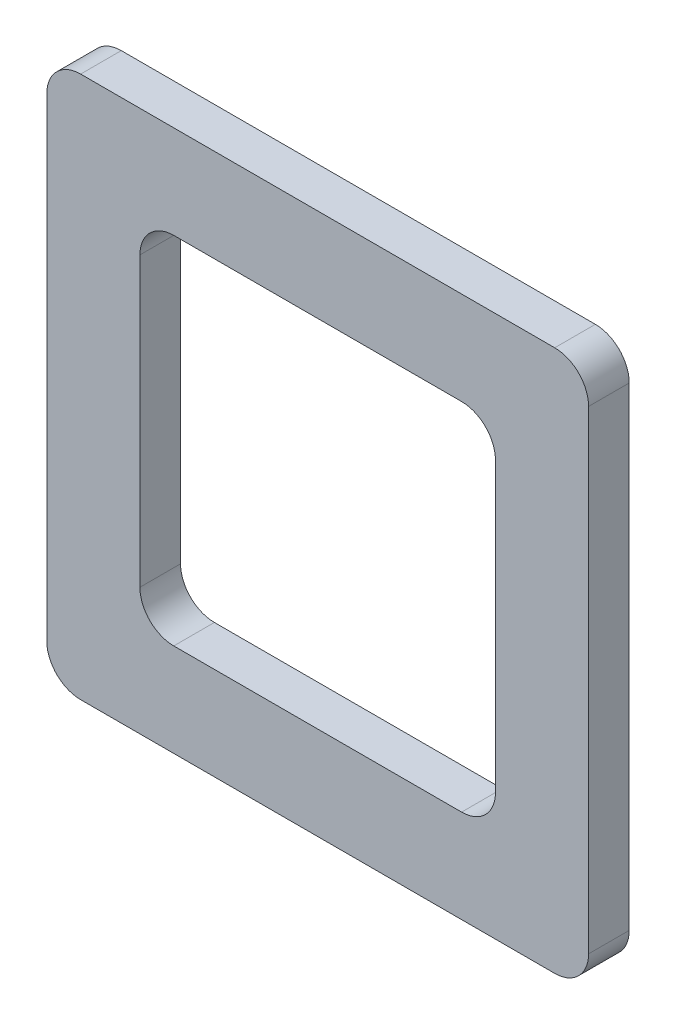
ISO-10303-21;
HEADER;
FILE_DESCRIPTION(('STEP AP214'),'2;1');
FILE_NAME('part.step','',(''),(''),'','','');
FILE_SCHEMA(('AUTOMOTIVE_DESIGN { 1 0 10303 214 1 1 1 1 }'));
ENDSEC;
DATA;
#1=APPLICATION_CONTEXT('core data for automotive mechanical design processes');
#2=APPLICATION_PROTOCOL_DEFINITION('international standard','automotive_design',2000,#1);
#3=PRODUCT_CONTEXT('',#1,'mechanical');
#4=PRODUCT('Part','Part','',(#3));
#5=PRODUCT_RELATED_PRODUCT_CATEGORY('part','',(#4));
#6=PRODUCT_DEFINITION_FORMATION('','',#4);
#7=PRODUCT_DEFINITION_CONTEXT('part definition',#1,'design');
#8=PRODUCT_DEFINITION('design','',#6,#7);
#9=PRODUCT_DEFINITION_SHAPE('','',#8);
#10=(LENGTH_UNIT() NAMED_UNIT(*) SI_UNIT(.MILLI.,.METRE.));
#11=(NAMED_UNIT(*) PLANE_ANGLE_UNIT() SI_UNIT($,.RADIAN.));
#12=(NAMED_UNIT(*) SI_UNIT($,.STERADIAN.) SOLID_ANGLE_UNIT());
#13=UNCERTAINTY_MEASURE_WITH_UNIT(LENGTH_MEASURE(1.E-05),#10,'distance_accuracy_value','');
#14=(GEOMETRIC_REPRESENTATION_CONTEXT(3) GLOBAL_UNCERTAINTY_ASSIGNED_CONTEXT((#13)) GLOBAL_UNIT_ASSIGNED_CONTEXT((#10,
#11,#12)) REPRESENTATION_CONTEXT('',''));
#15=CARTESIAN_POINT('',(0.,0.,0.));
#16=DIRECTION('',(0.,0.,1.));
#17=DIRECTION('',(1.,0.,0.));
#18=AXIS2_PLACEMENT_3D('',#15,#16,#17);
#19=CARTESIAN_POINT('',(9.99999999999979,150.,11.9999999999998));
#20=DIRECTION('',(0.,0.,-0.999999999999992));
#21=DIRECTION('',(-1.,0.,0.));
#22=AXIS2_PLACEMENT_3D('',#19,#20,#21);
#23=CYLINDRICAL_SURFACE('',#22,10.);
#24=CARTESIAN_POINT('',(9.9999999999999,150.,4.44089209850063E-13));
#25=DIRECTION('',(0.,0.,0.999999999999992));
#26=DIRECTION('',(-1.,0.,0.));
#27=AXIS2_PLACEMENT_3D('',#24,#25,#26);
#28=CIRCLE('',#27,10.);
#29=CARTESIAN_POINT('',(10.,160.,2.22044604925031E-13));
#30=VERTEX_POINT('',#29);
#31=CARTESIAN_POINT('',(-2.22044604925031E-13,150.,0.));
#32=VERTEX_POINT('',#31);
#33=EDGE_CURVE('E205',#30,#32,#28,.T.);
#34=ORIENTED_EDGE('',*,*,#33,.T.);
#35=DIRECTION('',(0.,0.,-0.999999999999992));
#36=VECTOR('',#35,1.);
#37=CARTESIAN_POINT('',(-3.33066907387547E-13,150.,12.));
#38=LINE('',#37,#36);
#39=CARTESIAN_POINT('',(-3.33066907387547E-13,150.,12.));
#40=VERTEX_POINT('',#39);
#41=EDGE_CURVE('E11',#40,#32,#38,.T.);
#42=ORIENTED_EDGE('',*,*,#41,.F.);
#43=CARTESIAN_POINT('',(9.99999999999979,150.,11.9999999999998));
#44=DIRECTION('',(0.,0.,0.999999999999992));
#45=DIRECTION('',(-1.,0.,0.));
#46=AXIS2_PLACEMENT_3D('',#43,#44,#45);
#47=CIRCLE('',#46,10.);
#48=CARTESIAN_POINT('',(9.9999999999999,160.,12.));
#49=VERTEX_POINT('',#48);
#50=EDGE_CURVE('E232',#49,#40,#47,.T.);
#51=ORIENTED_EDGE('',*,*,#50,.F.);
#52=DIRECTION('',(0.,0.,-0.999999999999992));
#53=VECTOR('',#52,1.);
#54=CARTESIAN_POINT('',(9.9999999999999,160.,12.));
#55=LINE('',#54,#53);
#56=EDGE_CURVE('E249',#49,#30,#55,.T.);
#57=ORIENTED_EDGE('',*,*,#56,.T.);
#58=EDGE_LOOP('',(#34,#42,#51,#57));
#59=FACE_BOUND('',#58,.T.);
#60=ADVANCED_FACE('F34',(#59),#23,.T.);
#61=CARTESIAN_POINT('',(-1.12757025938492E-13,10.0000000000001,11.9999999999998));
#62=DIRECTION('',(1.,0.,0.));
#63=DIRECTION('',(0.,0.,-0.999999999999992));
#64=AXIS2_PLACEMENT_3D('',#61,#62,#63);
#65=PLANE('',#64);
#66=DIRECTION('',(0.,-1.,0.));
#67=VECTOR('',#66,1.);
#68=CARTESIAN_POINT('',(-1.11022302462516E-13,10.0000000000001,4.44089209850063E-13));
#69=LINE('',#68,#67);
#70=CARTESIAN_POINT('',(-1.11022302462516E-13,10.0000000000001,4.44089209850063E-13));
#71=VERTEX_POINT('',#70);
#72=EDGE_CURVE('E218',#32,#71,#69,.T.);
#73=ORIENTED_EDGE('',*,*,#72,.T.);
#74=DIRECTION('',(0.,0.,-0.999999999999992));
#75=VECTOR('',#74,1.);
#76=CARTESIAN_POINT('',(-1.12757025938492E-13,10.0000000000001,11.9999999999998));
#77=LINE('',#76,#75);
#78=CARTESIAN_POINT('',(-1.12757025938492E-13,10.0000000000001,11.9999999999998));
#79=VERTEX_POINT('',#78);
#80=EDGE_CURVE('E41',#79,#71,#77,.T.);
#81=ORIENTED_EDGE('',*,*,#80,.F.);
#82=DIRECTION('',(0.,-1.,0.));
#83=VECTOR('',#82,1.);
#84=CARTESIAN_POINT('',(-1.12757025938492E-13,10.0000000000001,11.9999999999998));
#85=LINE('',#84,#83);
#86=EDGE_CURVE('E235',#40,#79,#85,.T.);
#87=ORIENTED_EDGE('',*,*,#86,.F.);
#88=ORIENTED_EDGE('',*,*,#41,.T.);
#89=EDGE_LOOP('',(#73,#81,#87,#88));
#90=FACE_BOUND('',#89,.T.);
#91=ADVANCED_FACE('F292',(#90),#65,.F.);
#92=CARTESIAN_POINT('',(9.9999999999999,10.0000000000002,12.));
#93=DIRECTION('',(0.,0.,-0.999999999999992));
#94=DIRECTION('',(-1.,0.,0.));
#95=AXIS2_PLACEMENT_3D('',#92,#93,#94);
#96=CYLINDRICAL_SURFACE('',#95,10.);
#97=CARTESIAN_POINT('',(9.9999999999999,10.0000000000001,0.));
#98=DIRECTION('',(0.,0.,0.999999999999992));
#99=DIRECTION('',(-1.,0.,0.));
#100=AXIS2_PLACEMENT_3D('',#97,#98,#99);
#101=CIRCLE('',#100,10.);
#102=CARTESIAN_POINT('',(10.0000000000001,1.11022302462516E-13,-2.22044604925031E-13));
#103=VERTEX_POINT('',#102);
#104=EDGE_CURVE('E220',#71,#103,#101,.T.);
#105=ORIENTED_EDGE('',*,*,#104,.T.);
#106=DIRECTION('',(0.,0.,-0.999999999999992));
#107=VECTOR('',#106,1.);
#108=CARTESIAN_POINT('',(9.99999999999996,2.22044604925031E-13,12.));
#109=LINE('',#108,#107);
#110=CARTESIAN_POINT('',(9.99999999999996,2.22044604925031E-13,12.));
#111=VERTEX_POINT('',#110);
#112=EDGE_CURVE('E264',#111,#103,#109,.T.);
#113=ORIENTED_EDGE('',*,*,#112,.F.);
#114=CARTESIAN_POINT('',(9.9999999999999,10.0000000000002,12.));
#115=DIRECTION('',(0.,0.,0.999999999999992));
#116=DIRECTION('',(-1.,0.,0.));
#117=AXIS2_PLACEMENT_3D('',#114,#115,#116);
#118=CIRCLE('',#117,10.);
#119=EDGE_CURVE('E237',#79,#111,#118,.T.);
#120=ORIENTED_EDGE('',*,*,#119,.F.);
#121=ORIENTED_EDGE('',*,*,#80,.T.);
#122=EDGE_LOOP('',(#105,#113,#120,#121));
#123=FACE_BOUND('',#122,.T.);
#124=ADVANCED_FACE('F271',(#123),#96,.T.);
#125=CARTESIAN_POINT('',(9.99999999999996,2.22044604925031E-13,12.));
#126=DIRECTION('',(0.,1.,0.));
#127=DIRECTION('',(0.,0.,0.999999999999992));
#128=AXIS2_PLACEMENT_3D('',#125,#126,#127);
#129=PLANE('',#128);
#130=DIRECTION('',(1.,0.,0.));
#131=VECTOR('',#130,1.);
#132=CARTESIAN_POINT('',(10.0000000000001,1.11022302462516E-13,-2.22044604925031E-13));
#133=LINE('',#132,#131);
#134=CARTESIAN_POINT('',(150.,2.22044604925031E-13,4.44089209850063E-13));
#135=VERTEX_POINT('',#134);
#136=EDGE_CURVE('E222',#103,#135,#133,.T.);
#137=ORIENTED_EDGE('',*,*,#136,.T.);
#138=DIRECTION('',(0.,0.,-0.999999999999992));
#139=VECTOR('',#138,1.);
#140=CARTESIAN_POINT('',(150.,0.,11.9999999999993));
#141=LINE('',#140,#139);
#142=CARTESIAN_POINT('',(150.,0.,11.9999999999993));
#143=VERTEX_POINT('',#142);
#144=EDGE_CURVE('E261',#143,#135,#141,.T.);
#145=ORIENTED_EDGE('',*,*,#144,.F.);
#146=DIRECTION('',(1.,0.,0.));
#147=VECTOR('',#146,1.);
#148=CARTESIAN_POINT('',(9.99999999999996,2.22044604925031E-13,12.));
#149=LINE('',#148,#147);
#150=EDGE_CURVE('E239',#111,#143,#149,.T.);
#151=ORIENTED_EDGE('',*,*,#150,.F.);
#152=ORIENTED_EDGE('',*,*,#112,.T.);
#153=EDGE_LOOP('',(#137,#145,#151,#152));
#154=FACE_BOUND('',#153,.T.);
#155=ADVANCED_FACE('F282',(#154),#129,.F.);
#156=CARTESIAN_POINT('',(150.,10.0000000000002,11.9999999999998));
#157=DIRECTION('',(0.,0.,-0.999999999999992));
#158=DIRECTION('',(-1.,0.,0.));
#159=AXIS2_PLACEMENT_3D('',#156,#157,#158);
#160=CYLINDRICAL_SURFACE('',#159,9.99999999999999);
#161=CARTESIAN_POINT('',(150.,10.0000000000002,-4.44089209850063E-13));
#162=DIRECTION('',(0.,0.,0.999999999999992));
#163=DIRECTION('',(1.,0.,0.));
#164=AXIS2_PLACEMENT_3D('',#161,#162,#163);
#165=CIRCLE('',#164,9.99999999999999);
#166=CARTESIAN_POINT('',(160.,10.0000000000002,0.));
#167=VERTEX_POINT('',#166);
#168=EDGE_CURVE('E224',#135,#167,#165,.T.);
#169=ORIENTED_EDGE('',*,*,#168,.T.);
#170=DIRECTION('',(0.,0.,-0.999999999999992));
#171=VECTOR('',#170,1.);
#172=CARTESIAN_POINT('',(160.,10.0000000000002,12.));
#173=LINE('',#172,#171);
#174=CARTESIAN_POINT('',(160.,10.0000000000002,12.));
#175=VERTEX_POINT('',#174);
#176=EDGE_CURVE('E258',#175,#167,#173,.T.);
#177=ORIENTED_EDGE('',*,*,#176,.F.);
#178=CARTESIAN_POINT('',(150.,10.0000000000002,11.9999999999998));
#179=DIRECTION('',(0.,0.,0.999999999999992));
#180=DIRECTION('',(1.,0.,0.));
#181=AXIS2_PLACEMENT_3D('',#178,#179,#180);
#182=CIRCLE('',#181,9.99999999999999);
#183=EDGE_CURVE('E241',#143,#175,#182,.T.);
#184=ORIENTED_EDGE('',*,*,#183,.F.);
#185=ORIENTED_EDGE('',*,*,#144,.T.);
#186=EDGE_LOOP('',(#169,#177,#184,#185));
#187=FACE_BOUND('',#186,.T.);
#188=ADVANCED_FACE('F286',(#187),#160,.T.);
#189=CARTESIAN_POINT('',(160.,10.0000000000002,12.));
#190=DIRECTION('',(-1.,0.,0.));
#191=DIRECTION('',(0.,0.,0.999999999999992));
#192=AXIS2_PLACEMENT_3D('',#189,#190,#191);
#193=PLANE('',#192);
#194=DIRECTION('',(0.,1.,0.));
#195=VECTOR('',#194,1.);
#196=CARTESIAN_POINT('',(160.,10.0000000000002,0.));
#197=LINE('',#196,#195);
#198=CARTESIAN_POINT('',(160.,150.,2.22044604925031E-13));
#199=VERTEX_POINT('',#198);
#200=EDGE_CURVE('E226',#167,#199,#197,.T.);
#201=ORIENTED_EDGE('',*,*,#200,.T.);
#202=DIRECTION('',(0.,0.,-0.999999999999992));
#203=VECTOR('',#202,1.);
#204=CARTESIAN_POINT('',(160.,150.,11.9999999999996));
#205=LINE('',#204,#203);
#206=CARTESIAN_POINT('',(160.,150.,11.9999999999996));
#207=VERTEX_POINT('',#206);
#208=EDGE_CURVE('E255',#207,#199,#205,.T.);
#209=ORIENTED_EDGE('',*,*,#208,.F.);
#210=DIRECTION('',(0.,1.,0.));
#211=VECTOR('',#210,1.);
#212=CARTESIAN_POINT('',(160.,10.0000000000002,12.));
#213=LINE('',#212,#211);
#214=EDGE_CURVE('E243',#175,#207,#213,.T.);
#215=ORIENTED_EDGE('',*,*,#214,.F.);
#216=ORIENTED_EDGE('',*,*,#176,.T.);
#217=EDGE_LOOP('',(#201,#209,#215,#216));
#218=FACE_BOUND('',#217,.T.);
#219=ADVANCED_FACE('F305',(#218),#193,.F.);
#220=CARTESIAN_POINT('',(150.,150.,11.9999999999996));
#221=DIRECTION('',(0.,0.,-0.999999999999992));
#222=DIRECTION('',(-1.,0.,0.));
#223=AXIS2_PLACEMENT_3D('',#220,#221,#222);
#224=CYLINDRICAL_SURFACE('',#223,9.99999999999999);
#225=CARTESIAN_POINT('',(150.,150.,6.66133814775094E-13));
#226=DIRECTION('',(0.,0.,0.999999999999992));
#227=DIRECTION('',(-1.,0.,0.));
#228=AXIS2_PLACEMENT_3D('',#225,#226,#227);
#229=CIRCLE('',#228,9.99999999999999);
#230=CARTESIAN_POINT('',(149.999999999999,160.,1.11022302462516E-13));
#231=VERTEX_POINT('',#230);
#232=EDGE_CURVE('E228',#199,#231,#229,.T.);
#233=ORIENTED_EDGE('',*,*,#232,.T.);
#234=DIRECTION('',(0.,0.,-0.999999999999992));
#235=VECTOR('',#234,1.);
#236=CARTESIAN_POINT('',(150.,160.,12.0000000000001));
#237=LINE('',#236,#235);
#238=CARTESIAN_POINT('',(150.,160.,12.0000000000001));
#239=VERTEX_POINT('',#238);
#240=EDGE_CURVE('E252',#239,#231,#237,.T.);
#241=ORIENTED_EDGE('',*,*,#240,.F.);
#242=CARTESIAN_POINT('',(150.,150.,11.9999999999996));
#243=DIRECTION('',(0.,0.,0.999999999999992));
#244=DIRECTION('',(-1.,0.,0.));
#245=AXIS2_PLACEMENT_3D('',#242,#243,#244);
#246=CIRCLE('',#245,9.99999999999999);
#247=EDGE_CURVE('E245',#207,#239,#246,.T.);
#248=ORIENTED_EDGE('',*,*,#247,.F.);
#249=ORIENTED_EDGE('',*,*,#208,.T.);
#250=EDGE_LOOP('',(#233,#241,#248,#249));
#251=FACE_BOUND('',#250,.T.);
#252=ADVANCED_FACE('F303',(#251),#224,.T.);
#253=CARTESIAN_POINT('',(9.9999999999999,160.,12.));
#254=DIRECTION('',(0.,-1.,0.));
#255=DIRECTION('',(0.,0.,-0.999999999999992));
#256=AXIS2_PLACEMENT_3D('',#253,#254,#255);
#257=PLANE('',#256);
#258=DIRECTION('',(-1.,0.,0.));
#259=VECTOR('',#258,1.);
#260=CARTESIAN_POINT('',(10.,160.,2.22044604925031E-13));
#261=LINE('',#260,#259);
#262=EDGE_CURVE('E230',#231,#30,#261,.T.);
#263=ORIENTED_EDGE('',*,*,#262,.T.);
#264=ORIENTED_EDGE('',*,*,#56,.F.);
#265=DIRECTION('',(-1.,0.,0.));
#266=VECTOR('',#265,1.);
#267=CARTESIAN_POINT('',(9.9999999999999,160.,12.));
#268=LINE('',#267,#266);
#269=EDGE_CURVE('E247',#239,#49,#268,.T.);
#270=ORIENTED_EDGE('',*,*,#269,.F.);
#271=ORIENTED_EDGE('',*,*,#240,.T.);
#272=EDGE_LOOP('',(#263,#264,#270,#271));
#273=FACE_BOUND('',#272,.T.);
#274=ADVANCED_FACE('F298',(#273),#257,.F.);
#275=CARTESIAN_POINT('',(9.99999999999979,150.,11.9999999999998));
#276=DIRECTION('',(0.,0.,-0.999999999999992));
#277=DIRECTION('',(-1.,0.,0.));
#278=AXIS2_PLACEMENT_3D('',#275,#276,#277);
#279=PLANE('',#278);
#280=DIRECTION('',(0.,-1.,0.));
#281=VECTOR('',#280,1.);
#282=CARTESIAN_POINT('',(27.4999999999997,122.5,11.9999999999999));
#283=LINE('',#282,#281);
#284=CARTESIAN_POINT('',(27.4999999999997,122.5,11.9999999999999));
#285=VERTEX_POINT('',#284);
#286=CARTESIAN_POINT('',(27.4999999999998,37.5000000000002,12.0000000000005));
#287=VERTEX_POINT('',#286);
#288=EDGE_CURVE('E157',#285,#287,#283,.T.);
#289=ORIENTED_EDGE('',*,*,#288,.F.);
#290=CARTESIAN_POINT('',(37.4999999999996,122.5,12.0000000000006));
#291=DIRECTION('',(0.,0.,0.999999999999992));
#292=DIRECTION('',(-1.,0.,0.));
#293=AXIS2_PLACEMENT_3D('',#290,#291,#292);
#294=CIRCLE('',#293,10.);
#295=CARTESIAN_POINT('',(37.4999999999999,132.5,12.0000000000002));
#296=VERTEX_POINT('',#295);
#297=EDGE_CURVE('E48',#296,#285,#294,.T.);
#298=ORIENTED_EDGE('',*,*,#297,.F.);
#299=DIRECTION('',(-1.,0.,0.));
#300=VECTOR('',#299,1.);
#301=CARTESIAN_POINT('',(122.5,132.5,11.999999999999));
#302=LINE('',#301,#300);
#303=CARTESIAN_POINT('',(122.5,132.5,11.999999999999));
#304=VERTEX_POINT('',#303);
#305=EDGE_CURVE('E179',#304,#296,#302,.T.);
#306=ORIENTED_EDGE('',*,*,#305,.F.);
#307=CARTESIAN_POINT('',(122.5,122.5,12.));
#308=DIRECTION('',(0.,0.,0.999999999999992));
#309=DIRECTION('',(1.,0.,0.));
#310=AXIS2_PLACEMENT_3D('',#307,#308,#309);
#311=CIRCLE('',#310,10.);
#312=CARTESIAN_POINT('',(132.5,122.5,12.0000000000005));
#313=VERTEX_POINT('',#312);
#314=EDGE_CURVE('E176',#313,#304,#311,.T.);
#315=ORIENTED_EDGE('',*,*,#314,.F.);
#316=DIRECTION('',(0.,1.,0.));
#317=VECTOR('',#316,1.);
#318=CARTESIAN_POINT('',(132.5,37.5,12.0000000000003));
#319=LINE('',#318,#317);
#320=CARTESIAN_POINT('',(132.5,37.5,12.0000000000003));
#321=VERTEX_POINT('',#320);
#322=EDGE_CURVE('E173',#321,#313,#319,.T.);
#323=ORIENTED_EDGE('',*,*,#322,.F.);
#324=CARTESIAN_POINT('',(122.5,37.5000000000001,12.0000000000003));
#325=DIRECTION('',(0.,0.,0.999999999999992));
#326=DIRECTION('',(1.,0.,0.));
#327=AXIS2_PLACEMENT_3D('',#324,#325,#326);
#328=CIRCLE('',#327,10.);
#329=CARTESIAN_POINT('',(122.5,27.5000000000003,11.9999999999993));
#330=VERTEX_POINT('',#329);
#331=EDGE_CURVE('E167',#330,#321,#328,.T.);
#332=ORIENTED_EDGE('',*,*,#331,.F.);
#333=DIRECTION('',(1.,0.,0.));
#334=VECTOR('',#333,1.);
#335=CARTESIAN_POINT('',(37.5000000000001,27.5000000000001,11.9999999999998));
#336=LINE('',#335,#334);
#337=CARTESIAN_POINT('',(37.5000000000001,27.5000000000001,11.9999999999998));
#338=VERTEX_POINT('',#337);
#339=EDGE_CURVE('E165',#338,#330,#336,.T.);
#340=ORIENTED_EDGE('',*,*,#339,.F.);
#341=CARTESIAN_POINT('',(37.4999999999996,37.5,11.9999999999996));
#342=DIRECTION('',(0.,0.,0.999999999999992));
#343=DIRECTION('',(1.,0.,0.));
#344=AXIS2_PLACEMENT_3D('',#341,#342,#343);
#345=CIRCLE('',#344,10.);
#346=EDGE_CURVE('E148',#287,#338,#345,.T.);
#347=ORIENTED_EDGE('',*,*,#346,.F.);
#348=EDGE_LOOP('',(#289,#298,#306,#315,#323,#332,#340,#347));
#349=FACE_BOUND('',#348,.T.);
#350=ORIENTED_EDGE('',*,*,#50,.T.);
#351=ORIENTED_EDGE('',*,*,#86,.T.);
#352=ORIENTED_EDGE('',*,*,#119,.T.);
#353=ORIENTED_EDGE('',*,*,#150,.T.);
#354=ORIENTED_EDGE('',*,*,#183,.T.);
#355=ORIENTED_EDGE('',*,*,#214,.T.);
#356=ORIENTED_EDGE('',*,*,#247,.T.);
#357=ORIENTED_EDGE('',*,*,#269,.T.);
#358=EDGE_LOOP('',(#350,#351,#352,#353,#354,#355,#356,#357));
#359=FACE_BOUND('',#358,.T.);
#360=ADVANCED_FACE('F161',(#349,#359),#279,.F.);
#361=CARTESIAN_POINT('',(9.9999999999999,150.,4.44089209850063E-13));
#362=DIRECTION('',(0.,0.,-0.999999999999992));
#363=DIRECTION('',(-1.,0.,0.));
#364=AXIS2_PLACEMENT_3D('',#361,#362,#363);
#365=PLANE('',#364);
#366=CARTESIAN_POINT('',(37.4999999999998,122.5,1.11022302462516E-13));
#367=DIRECTION('',(0.,0.,0.999999999999992));
#368=DIRECTION('',(-1.,0.,0.));
#369=AXIS2_PLACEMENT_3D('',#366,#367,#368);
#370=CIRCLE('',#369,10.);
#371=CARTESIAN_POINT('',(37.4999999999999,132.5,-2.22044604925031E-13));
#372=VERTEX_POINT('',#371);
#373=CARTESIAN_POINT('',(27.4999999999997,122.5,7.7715611723761E-13));
#374=VERTEX_POINT('',#373);
#375=EDGE_CURVE('E182',#372,#374,#370,.T.);
#376=ORIENTED_EDGE('',*,*,#375,.T.);
#377=DIRECTION('',(0.,-1.,0.));
#378=VECTOR('',#377,1.);
#379=CARTESIAN_POINT('',(27.4999999999997,122.5,7.7715611723761E-13));
#380=LINE('',#379,#378);
#381=CARTESIAN_POINT('',(27.4999999999997,37.5000000000002,0.));
#382=VERTEX_POINT('',#381);
#383=EDGE_CURVE('E185',#374,#382,#380,.T.);
#384=ORIENTED_EDGE('',*,*,#383,.T.);
#385=CARTESIAN_POINT('',(37.4999999999997,37.5000000000002,-5.55111512312578E-13));
#386=DIRECTION('',(0.,0.,0.999999999999992));
#387=DIRECTION('',(1.,0.,0.));
#388=AXIS2_PLACEMENT_3D('',#385,#386,#387);
#389=CIRCLE('',#388,10.);
#390=CARTESIAN_POINT('',(37.4999999999999,27.5000000000001,-6.66133814775094E-13));
#391=VERTEX_POINT('',#390);
#392=EDGE_CURVE('E56',#382,#391,#389,.T.);
#393=ORIENTED_EDGE('',*,*,#392,.T.);
#394=DIRECTION('',(1.,0.,0.));
#395=VECTOR('',#394,1.);
#396=CARTESIAN_POINT('',(37.4999999999999,27.5000000000001,-6.66133814775094E-13));
#397=LINE('',#396,#395);
#398=CARTESIAN_POINT('',(122.5,27.5000000000003,0.));
#399=VERTEX_POINT('',#398);
#400=EDGE_CURVE('E188',#391,#399,#397,.T.);
#401=ORIENTED_EDGE('',*,*,#400,.T.);
#402=CARTESIAN_POINT('',(122.5,37.5000000000001,-1.11022302462516E-13));
#403=DIRECTION('',(0.,0.,0.999999999999992));
#404=DIRECTION('',(1.,0.,0.));
#405=AXIS2_PLACEMENT_3D('',#402,#403,#404);
#406=CIRCLE('',#405,10.);
#407=CARTESIAN_POINT('',(132.499999999999,37.5,1.11022302462516E-13));
#408=VERTEX_POINT('',#407);
#409=EDGE_CURVE('E191',#399,#408,#406,.T.);
#410=ORIENTED_EDGE('',*,*,#409,.T.);
#411=DIRECTION('',(0.,1.,0.));
#412=VECTOR('',#411,1.);
#413=CARTESIAN_POINT('',(132.499999999999,37.5,1.11022302462516E-13));
#414=LINE('',#413,#412);
#415=CARTESIAN_POINT('',(132.5,122.500000000001,0.));
#416=VERTEX_POINT('',#415);
#417=EDGE_CURVE('E194',#408,#416,#414,.T.);
#418=ORIENTED_EDGE('',*,*,#417,.T.);
#419=CARTESIAN_POINT('',(122.5,122.5,-2.22044604925031E-13));
#420=DIRECTION('',(0.,0.,0.999999999999992));
#421=DIRECTION('',(1.,0.,0.));
#422=AXIS2_PLACEMENT_3D('',#419,#420,#421);
#423=CIRCLE('',#422,10.);
#424=CARTESIAN_POINT('',(122.5,132.5,3.33066907387547E-13));
#425=VERTEX_POINT('',#424);
#426=EDGE_CURVE('E197',#416,#425,#423,.T.);
#427=ORIENTED_EDGE('',*,*,#426,.T.);
#428=DIRECTION('',(-1.,0.,0.));
#429=VECTOR('',#428,1.);
#430=CARTESIAN_POINT('',(122.5,132.5,3.33066907387547E-13));
#431=LINE('',#430,#429);
#432=EDGE_CURVE('E200',#425,#372,#431,.T.);
#433=ORIENTED_EDGE('',*,*,#432,.T.);
#434=EDGE_LOOP('',(#376,#384,#393,#401,#410,#418,#427,#433));
#435=FACE_BOUND('',#434,.T.);
#436=ORIENTED_EDGE('',*,*,#33,.F.);
#437=ORIENTED_EDGE('',*,*,#262,.F.);
#438=ORIENTED_EDGE('',*,*,#232,.F.);
#439=ORIENTED_EDGE('',*,*,#200,.F.);
#440=ORIENTED_EDGE('',*,*,#168,.F.);
#441=ORIENTED_EDGE('',*,*,#136,.F.);
#442=ORIENTED_EDGE('',*,*,#104,.F.);
#443=ORIENTED_EDGE('',*,*,#72,.F.);
#444=EDGE_LOOP('',(#436,#437,#438,#439,#440,#441,#442,#443));
#445=FACE_BOUND('',#444,.T.);
#446=ADVANCED_FACE('F277',(#435,#445),#365,.T.);
#447=CARTESIAN_POINT('',(37.4999999999998,122.5,1.11022302462516E-13));
#448=DIRECTION('',(0.,0.,0.999999999999992));
#449=DIRECTION('',(1.,0.,0.));
#450=AXIS2_PLACEMENT_3D('',#447,#448,#449);
#451=CYLINDRICAL_SURFACE('',#450,10.);
#452=ORIENTED_EDGE('',*,*,#297,.T.);
#453=DIRECTION('',(0.,0.,0.999999999999992));
#454=VECTOR('',#453,1.);
#455=CARTESIAN_POINT('',(27.4999999999997,122.5,7.7715611723761E-13));
#456=LINE('',#455,#454);
#457=EDGE_CURVE('E154',#374,#285,#456,.T.);
#458=ORIENTED_EDGE('',*,*,#457,.F.);
#459=ORIENTED_EDGE('',*,*,#375,.F.);
#460=DIRECTION('',(0.,0.,0.999999999999992));
#461=VECTOR('',#460,1.);
#462=CARTESIAN_POINT('',(37.4999999999999,132.5,-2.22044604925031E-13));
#463=LINE('',#462,#461);
#464=EDGE_CURVE('E203',#372,#296,#463,.T.);
#465=ORIENTED_EDGE('',*,*,#464,.T.);
#466=EDGE_LOOP('',(#452,#458,#459,#465));
#467=FACE_BOUND('',#466,.T.);
#468=ADVANCED_FACE('F367',(#467),#451,.F.);
#469=CARTESIAN_POINT('',(122.5,132.5,3.33066907387547E-13));
#470=DIRECTION('',(0.,1.,0.));
#471=DIRECTION('',(-1.,0.,0.));
#472=AXIS2_PLACEMENT_3D('',#469,#470,#471);
#473=PLANE('',#472);
#474=ORIENTED_EDGE('',*,*,#305,.T.);
#475=ORIENTED_EDGE('',*,*,#464,.F.);
#476=ORIENTED_EDGE('',*,*,#432,.F.);
#477=DIRECTION('',(0.,0.,0.999999999999992));
#478=VECTOR('',#477,1.);
#479=CARTESIAN_POINT('',(122.5,132.5,3.33066907387547E-13));
#480=LINE('',#479,#478);
#481=EDGE_CURVE('E206',#425,#304,#480,.T.);
#482=ORIENTED_EDGE('',*,*,#481,.T.);
#483=EDGE_LOOP('',(#474,#475,#476,#482));
#484=FACE_BOUND('',#483,.T.);
#485=ADVANCED_FACE('F377',(#484),#473,.F.);
#486=CARTESIAN_POINT('',(122.5,122.5,-2.22044604925031E-13));
#487=DIRECTION('',(0.,0.,0.999999999999992));
#488=DIRECTION('',(1.,0.,0.));
#489=AXIS2_PLACEMENT_3D('',#486,#487,#488);
#490=CYLINDRICAL_SURFACE('',#489,10.);
#491=ORIENTED_EDGE('',*,*,#314,.T.);
#492=ORIENTED_EDGE('',*,*,#481,.F.);
#493=ORIENTED_EDGE('',*,*,#426,.F.);
#494=DIRECTION('',(0.,0.,0.999999999999992));
#495=VECTOR('',#494,1.);
#496=CARTESIAN_POINT('',(132.5,122.500000000001,0.));
#497=LINE('',#496,#495);
#498=EDGE_CURVE('E208',#416,#313,#497,.T.);
#499=ORIENTED_EDGE('',*,*,#498,.T.);
#500=EDGE_LOOP('',(#491,#492,#493,#499));
#501=FACE_BOUND('',#500,.T.);
#502=ADVANCED_FACE('F386',(#501),#490,.F.);
#503=CARTESIAN_POINT('',(132.499999999999,37.5,1.11022302462516E-13));
#504=DIRECTION('',(1.,0.,0.));
#505=DIRECTION('',(0.,1.,0.));
#506=AXIS2_PLACEMENT_3D('',#503,#504,#505);
#507=PLANE('',#506);
#508=ORIENTED_EDGE('',*,*,#322,.T.);
#509=ORIENTED_EDGE('',*,*,#498,.F.);
#510=ORIENTED_EDGE('',*,*,#417,.F.);
#511=DIRECTION('',(0.,0.,0.999999999999992));
#512=VECTOR('',#511,1.);
#513=CARTESIAN_POINT('',(132.499999999999,37.5,1.11022302462516E-13));
#514=LINE('',#513,#512);
#515=EDGE_CURVE('E210',#408,#321,#514,.T.);
#516=ORIENTED_EDGE('',*,*,#515,.T.);
#517=EDGE_LOOP('',(#508,#509,#510,#516));
#518=FACE_BOUND('',#517,.T.);
#519=ADVANCED_FACE('F396',(#518),#507,.F.);
#520=CARTESIAN_POINT('',(122.5,37.5000000000001,-1.11022302462516E-13));
#521=DIRECTION('',(0.,0.,0.999999999999992));
#522=DIRECTION('',(1.,0.,0.));
#523=AXIS2_PLACEMENT_3D('',#520,#521,#522);
#524=CYLINDRICAL_SURFACE('',#523,10.);
#525=ORIENTED_EDGE('',*,*,#331,.T.);
#526=ORIENTED_EDGE('',*,*,#515,.F.);
#527=ORIENTED_EDGE('',*,*,#409,.F.);
#528=DIRECTION('',(0.,0.,0.999999999999992));
#529=VECTOR('',#528,1.);
#530=CARTESIAN_POINT('',(122.5,27.5000000000003,0.));
#531=LINE('',#530,#529);
#532=EDGE_CURVE('E212',#399,#330,#531,.T.);
#533=ORIENTED_EDGE('',*,*,#532,.T.);
#534=EDGE_LOOP('',(#525,#526,#527,#533));
#535=FACE_BOUND('',#534,.T.);
#536=ADVANCED_FACE('F406',(#535),#524,.F.);
#537=CARTESIAN_POINT('',(37.4999999999999,27.5000000000001,-6.66133814775094E-13));
#538=DIRECTION('',(0.,-1.,0.));
#539=DIRECTION('',(0.,0.,-0.999999999999992));
#540=AXIS2_PLACEMENT_3D('',#537,#538,#539);
#541=PLANE('',#540);
#542=ORIENTED_EDGE('',*,*,#339,.T.);
#543=ORIENTED_EDGE('',*,*,#532,.F.);
#544=ORIENTED_EDGE('',*,*,#400,.F.);
#545=DIRECTION('',(0.,0.,0.999999999999992));
#546=VECTOR('',#545,1.);
#547=CARTESIAN_POINT('',(37.4999999999999,27.5000000000001,-6.66133814775094E-13));
#548=LINE('',#547,#546);
#549=EDGE_CURVE('E153',#391,#338,#548,.T.);
#550=ORIENTED_EDGE('',*,*,#549,.T.);
#551=EDGE_LOOP('',(#542,#543,#544,#550));
#552=FACE_BOUND('',#551,.T.);
#553=ADVANCED_FACE('F416',(#552),#541,.F.);
#554=CARTESIAN_POINT('',(37.4999999999997,37.5000000000002,-5.55111512312578E-13));
#555=DIRECTION('',(0.,0.,0.999999999999992));
#556=DIRECTION('',(1.,0.,0.));
#557=AXIS2_PLACEMENT_3D('',#554,#555,#556);
#558=CYLINDRICAL_SURFACE('',#557,10.);
#559=ORIENTED_EDGE('',*,*,#346,.T.);
#560=ORIENTED_EDGE('',*,*,#549,.F.);
#561=ORIENTED_EDGE('',*,*,#392,.F.);
#562=DIRECTION('',(0.,0.,0.999999999999992));
#563=VECTOR('',#562,1.);
#564=CARTESIAN_POINT('',(27.4999999999997,37.5000000000002,0.));
#565=LINE('',#564,#563);
#566=EDGE_CURVE('E144',#382,#287,#565,.T.);
#567=ORIENTED_EDGE('',*,*,#566,.T.);
#568=EDGE_LOOP('',(#559,#560,#561,#567));
#569=FACE_BOUND('',#568,.T.);
#570=ADVANCED_FACE('F146',(#569),#558,.F.);
#571=CARTESIAN_POINT('',(27.4999999999997,122.5,7.7715611723761E-13));
#572=DIRECTION('',(-1.,0.,0.));
#573=DIRECTION('',(0.,0.,0.999999999999992));
#574=AXIS2_PLACEMENT_3D('',#571,#572,#573);
#575=PLANE('',#574);
#576=ORIENTED_EDGE('',*,*,#288,.T.);
#577=ORIENTED_EDGE('',*,*,#566,.F.);
#578=ORIENTED_EDGE('',*,*,#383,.F.);
#579=ORIENTED_EDGE('',*,*,#457,.T.);
#580=EDGE_LOOP('',(#576,#577,#578,#579));
#581=FACE_BOUND('',#580,.T.);
#582=ADVANCED_FACE('F158',(#581),#575,.F.);
#583=CLOSED_SHELL('',(#60,#91,#124,#155,#188,#219,#252,#274,#360,#446,#468,#485,#502,#519,#536,
#553,#570,#582));
#584=MANIFOLD_SOLID_BREP('B2',#583);
#585=ADVANCED_BREP_SHAPE_REPRESENTATION('',(#18,#584),#14);
#586=SHAPE_DEFINITION_REPRESENTATION(#9,#585);
ENDSEC;
END-ISO-10303-21;
